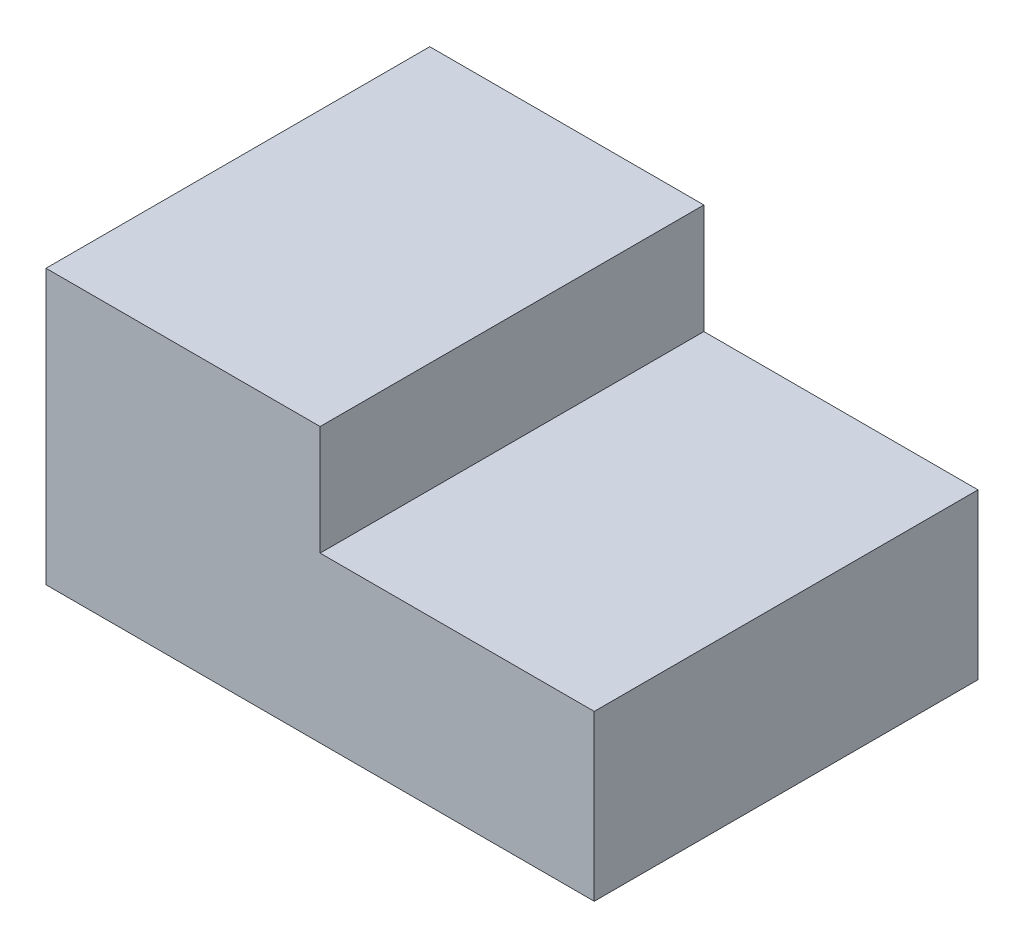
ISO-10303-21;
HEADER;
FILE_DESCRIPTION(('STEP AP214'),'2;1');
FILE_NAME('part.step','',(''),(''),'','','');
FILE_SCHEMA(('AUTOMOTIVE_DESIGN { 1 0 10303 214 1 1 1 1 }'));
ENDSEC;
DATA;
#1=APPLICATION_CONTEXT('core data for automotive mechanical design processes');
#2=APPLICATION_PROTOCOL_DEFINITION('international standard','automotive_design',2000,#1);
#3=PRODUCT_CONTEXT('',#1,'mechanical');
#4=PRODUCT('Part','Part','',(#3));
#5=PRODUCT_RELATED_PRODUCT_CATEGORY('part','',(#4));
#6=PRODUCT_DEFINITION_FORMATION('','',#4);
#7=PRODUCT_DEFINITION_CONTEXT('part definition',#1,'design');
#8=PRODUCT_DEFINITION('design','',#6,#7);
#9=PRODUCT_DEFINITION_SHAPE('','',#8);
#10=(LENGTH_UNIT() NAMED_UNIT(*) SI_UNIT(.MILLI.,.METRE.));
#11=(NAMED_UNIT(*) PLANE_ANGLE_UNIT() SI_UNIT($,.RADIAN.));
#12=(NAMED_UNIT(*) SI_UNIT($,.STERADIAN.) SOLID_ANGLE_UNIT());
#13=UNCERTAINTY_MEASURE_WITH_UNIT(LENGTH_MEASURE(1.E-05),#10,'distance_accuracy_value','');
#14=(GEOMETRIC_REPRESENTATION_CONTEXT(3) GLOBAL_UNCERTAINTY_ASSIGNED_CONTEXT((#13)) GLOBAL_UNIT_ASSIGNED_CONTEXT((#10,
#11,#12)) REPRESENTATION_CONTEXT('',''));
#15=CARTESIAN_POINT('',(0.,0.,0.));
#16=DIRECTION('',(0.,0.,1.));
#17=DIRECTION('',(1.,0.,0.));
#18=AXIS2_PLACEMENT_3D('',#15,#16,#17);
#19=CARTESIAN_POINT('',(0.,5.,3.5));
#20=DIRECTION('',(1.,0.,0.));
#21=DIRECTION('',(0.,0.,-1.));
#22=AXIS2_PLACEMENT_3D('',#19,#20,#21);
#23=PLANE('',#22);
#24=DIRECTION('',(0.,-1.,0.));
#25=VECTOR('',#24,1.);
#26=CARTESIAN_POINT('',(0.,4.1,-1.6));
#27=LINE('',#26,#25);
#28=CARTESIAN_POINT('',(0.,4.1,-1.6));
#29=VERTEX_POINT('',#28);
#30=CARTESIAN_POINT('',(0.,0.9,-1.6));
#31=VERTEX_POINT('',#30);
#32=EDGE_CURVE('E176',#29,#31,#27,.T.);
#33=ORIENTED_EDGE('',*,*,#32,.F.);
#34=DIRECTION('',(0.,0.,-1.));
#35=VECTOR('',#34,1.);
#36=CARTESIAN_POINT('',(0.,4.1,1.6));
#37=LINE('',#36,#35);
#38=CARTESIAN_POINT('',(0.,4.1,1.6));
#39=VERTEX_POINT('',#38);
#40=EDGE_CURVE('E48',#39,#29,#37,.T.);
#41=ORIENTED_EDGE('',*,*,#40,.F.);
#42=DIRECTION('',(0.,1.,0.));
#43=VECTOR('',#42,1.);
#44=CARTESIAN_POINT('',(0.,4.1,1.6));
#45=LINE('',#44,#43);
#46=CARTESIAN_POINT('',(0.,0.9,1.6));
#47=VERTEX_POINT('',#46);
#48=EDGE_CURVE('E169',#47,#39,#45,.T.);
#49=ORIENTED_EDGE('',*,*,#48,.F.);
#50=DIRECTION('',(0.,0.,1.));
#51=VECTOR('',#50,1.);
#52=CARTESIAN_POINT('',(0.,0.9,1.6));
#53=LINE('',#52,#51);
#54=EDGE_CURVE('E173',#31,#47,#53,.T.);
#55=ORIENTED_EDGE('',*,*,#54,.F.);
#56=EDGE_LOOP('',(#33,#41,#49,#55));
#57=FACE_BOUND('',#56,.T.);
#58=DIRECTION('',(0.,-1.,0.));
#59=VECTOR('',#58,1.);
#60=CARTESIAN_POINT('',(0.,5.,-3.5));
#61=LINE('',#60,#59);
#62=CARTESIAN_POINT('',(0.,5.,-3.5));
#63=VERTEX_POINT('',#62);
#64=CARTESIAN_POINT('',(0.,0.,-3.5));
#65=VERTEX_POINT('',#64);
#66=EDGE_CURVE('E130',#63,#65,#61,.T.);
#67=ORIENTED_EDGE('',*,*,#66,.T.);
#68=DIRECTION('',(0.,0.,-1.));
#69=VECTOR('',#68,1.);
#70=CARTESIAN_POINT('',(0.,0.,3.5));
#71=LINE('',#70,#69);
#72=CARTESIAN_POINT('',(0.,0.,3.5));
#73=VERTEX_POINT('',#72);
#74=EDGE_CURVE('E11',#73,#65,#71,.T.);
#75=ORIENTED_EDGE('',*,*,#74,.F.);
#76=DIRECTION('',(0.,-1.,0.));
#77=VECTOR('',#76,1.);
#78=CARTESIAN_POINT('',(0.,5.,3.5));
#79=LINE('',#78,#77);
#80=CARTESIAN_POINT('',(0.,5.,3.5));
#81=VERTEX_POINT('',#80);
#82=EDGE_CURVE('E142',#81,#73,#79,.T.);
#83=ORIENTED_EDGE('',*,*,#82,.F.);
#84=DIRECTION('',(0.,0.,-1.));
#85=VECTOR('',#84,1.);
#86=CARTESIAN_POINT('',(0.,5.,3.5));
#87=LINE('',#86,#85);
#88=EDGE_CURVE('E126',#81,#63,#87,.T.);
#89=ORIENTED_EDGE('',*,*,#88,.T.);
#90=EDGE_LOOP('',(#67,#75,#83,#89));
#91=FACE_BOUND('',#90,.T.);
#92=ADVANCED_FACE('F34',(#57,#91),#23,.F.);
#93=CARTESIAN_POINT('',(0.,0.,3.5));
#94=DIRECTION('',(0.,1.,0.));
#95=DIRECTION('',(0.,0.,1.));
#96=AXIS2_PLACEMENT_3D('',#93,#94,#95);
#97=PLANE('',#96);
#98=DIRECTION('',(1.,0.,0.));
#99=VECTOR('',#98,1.);
#100=CARTESIAN_POINT('',(0.,0.,-3.5));
#101=LINE('',#100,#99);
#102=CARTESIAN_POINT('',(10.,0.,-3.5));
#103=VERTEX_POINT('',#102);
#104=EDGE_CURVE('E133',#65,#103,#101,.T.);
#105=ORIENTED_EDGE('',*,*,#104,.T.);
#106=DIRECTION('',(0.,0.,-1.));
#107=VECTOR('',#106,1.);
#108=CARTESIAN_POINT('',(10.,0.,3.5));
#109=LINE('',#108,#107);
#110=CARTESIAN_POINT('',(10.,0.,3.5));
#111=VERTEX_POINT('',#110);
#112=EDGE_CURVE('E41',#111,#103,#109,.T.);
#113=ORIENTED_EDGE('',*,*,#112,.F.);
#114=DIRECTION('',(1.,0.,0.));
#115=VECTOR('',#114,1.);
#116=CARTESIAN_POINT('',(0.,0.,3.5));
#117=LINE('',#116,#115);
#118=EDGE_CURVE('E92',#73,#111,#117,.T.);
#119=ORIENTED_EDGE('',*,*,#118,.F.);
#120=ORIENTED_EDGE('',*,*,#74,.T.);
#121=EDGE_LOOP('',(#105,#113,#119,#120));
#122=FACE_BOUND('',#121,.T.);
#123=ADVANCED_FACE('F229',(#122),#97,.F.);
#124=CARTESIAN_POINT('',(10.,0.,3.5));
#125=DIRECTION('',(-1.,0.,0.));
#126=DIRECTION('',(0.,0.,1.));
#127=AXIS2_PLACEMENT_3D('',#124,#125,#126);
#128=PLANE('',#127);
#129=DIRECTION('',(0.,1.,0.));
#130=VECTOR('',#129,1.);
#131=CARTESIAN_POINT('',(10.,0.,-3.5));
#132=LINE('',#131,#130);
#133=CARTESIAN_POINT('',(10.,3.,-3.5));
#134=VERTEX_POINT('',#133);
#135=EDGE_CURVE('E136',#103,#134,#132,.T.);
#136=ORIENTED_EDGE('',*,*,#135,.T.);
#137=DIRECTION('',(0.,0.,-1.));
#138=VECTOR('',#137,1.);
#139=CARTESIAN_POINT('',(10.,3.,3.5));
#140=LINE('',#139,#138);
#141=CARTESIAN_POINT('',(10.,3.,3.5));
#142=VERTEX_POINT('',#141);
#143=EDGE_CURVE('E121',#142,#134,#140,.T.);
#144=ORIENTED_EDGE('',*,*,#143,.F.);
#145=DIRECTION('',(0.,1.,0.));
#146=VECTOR('',#145,1.);
#147=CARTESIAN_POINT('',(10.,0.,3.5));
#148=LINE('',#147,#146);
#149=EDGE_CURVE('E109',#111,#142,#148,.T.);
#150=ORIENTED_EDGE('',*,*,#149,.F.);
#151=ORIENTED_EDGE('',*,*,#112,.T.);
#152=EDGE_LOOP('',(#136,#144,#150,#151));
#153=FACE_BOUND('',#152,.T.);
#154=ADVANCED_FACE('F148',(#153),#128,.F.);
#155=CARTESIAN_POINT('',(10.,3.,3.5));
#156=DIRECTION('',(0.,-1.,0.));
#157=DIRECTION('',(1.,0.,0.));
#158=AXIS2_PLACEMENT_3D('',#155,#156,#157);
#159=PLANE('',#158);
#160=DIRECTION('',(-1.,0.,0.));
#161=VECTOR('',#160,1.);
#162=CARTESIAN_POINT('',(10.,3.,-3.5));
#163=LINE('',#162,#161);
#164=CARTESIAN_POINT('',(5.,3.,-3.5));
#165=VERTEX_POINT('',#164);
#166=EDGE_CURVE('E118',#134,#165,#163,.T.);
#167=ORIENTED_EDGE('',*,*,#166,.T.);
#168=DIRECTION('',(0.,0.,-1.));
#169=VECTOR('',#168,1.);
#170=CARTESIAN_POINT('',(5.,3.,3.5));
#171=LINE('',#170,#169);
#172=CARTESIAN_POINT('',(5.,3.,3.5));
#173=VERTEX_POINT('',#172);
#174=EDGE_CURVE('E115',#173,#165,#171,.T.);
#175=ORIENTED_EDGE('',*,*,#174,.F.);
#176=DIRECTION('',(-1.,0.,0.));
#177=VECTOR('',#176,1.);
#178=CARTESIAN_POINT('',(10.,3.,3.5));
#179=LINE('',#178,#177);
#180=EDGE_CURVE('E102',#142,#173,#179,.T.);
#181=ORIENTED_EDGE('',*,*,#180,.F.);
#182=ORIENTED_EDGE('',*,*,#143,.T.);
#183=EDGE_LOOP('',(#167,#175,#181,#182));
#184=FACE_BOUND('',#183,.T.);
#185=ADVANCED_FACE('F116',(#184),#159,.F.);
#186=CARTESIAN_POINT('',(5.,3.,3.5));
#187=DIRECTION('',(-1.,0.,0.));
#188=DIRECTION('',(0.,0.,1.));
#189=AXIS2_PLACEMENT_3D('',#186,#187,#188);
#190=PLANE('',#189);
#191=DIRECTION('',(0.,1.,0.));
#192=VECTOR('',#191,1.);
#193=CARTESIAN_POINT('',(5.,3.,-3.5));
#194=LINE('',#193,#192);
#195=CARTESIAN_POINT('',(5.,5.,-3.5));
#196=VERTEX_POINT('',#195);
#197=EDGE_CURVE('E139',#165,#196,#194,.T.);
#198=ORIENTED_EDGE('',*,*,#197,.T.);
#199=DIRECTION('',(0.,0.,-1.));
#200=VECTOR('',#199,1.);
#201=CARTESIAN_POINT('',(5.,5.,3.5));
#202=LINE('',#201,#200);
#203=CARTESIAN_POINT('',(5.,5.,3.5));
#204=VERTEX_POINT('',#203);
#205=EDGE_CURVE('E122',#204,#196,#202,.T.);
#206=ORIENTED_EDGE('',*,*,#205,.F.);
#207=DIRECTION('',(0.,1.,0.));
#208=VECTOR('',#207,1.);
#209=CARTESIAN_POINT('',(5.,3.,3.5));
#210=LINE('',#209,#208);
#211=EDGE_CURVE('E106',#173,#204,#210,.T.);
#212=ORIENTED_EDGE('',*,*,#211,.F.);
#213=ORIENTED_EDGE('',*,*,#174,.T.);
#214=EDGE_LOOP('',(#198,#206,#212,#213));
#215=FACE_BOUND('',#214,.T.);
#216=ADVANCED_FACE('F124',(#215),#190,.F.);
#217=CARTESIAN_POINT('',(5.,5.,3.5));
#218=DIRECTION('',(0.,-1.,0.));
#219=DIRECTION('',(1.,0.,0.));
#220=AXIS2_PLACEMENT_3D('',#217,#218,#219);
#221=PLANE('',#220);
#222=DIRECTION('',(-1.,0.,0.));
#223=VECTOR('',#222,1.);
#224=CARTESIAN_POINT('',(5.,5.,-3.5));
#225=LINE('',#224,#223);
#226=EDGE_CURVE('E84',#196,#63,#225,.T.);
#227=ORIENTED_EDGE('',*,*,#226,.T.);
#228=ORIENTED_EDGE('',*,*,#88,.F.);
#229=DIRECTION('',(-1.,0.,0.));
#230=VECTOR('',#229,1.);
#231=CARTESIAN_POINT('',(5.,5.,3.5));
#232=LINE('',#231,#230);
#233=EDGE_CURVE('E57',#204,#81,#232,.T.);
#234=ORIENTED_EDGE('',*,*,#233,.F.);
#235=ORIENTED_EDGE('',*,*,#205,.T.);
#236=EDGE_LOOP('',(#227,#228,#234,#235));
#237=FACE_BOUND('',#236,.T.);
#238=ADVANCED_FACE('F152',(#237),#221,.F.);
#239=CARTESIAN_POINT('',(0.,0.,3.5));
#240=DIRECTION('',(0.,0.,1.));
#241=DIRECTION('',(1.,0.,0.));
#242=AXIS2_PLACEMENT_3D('',#239,#240,#241);
#243=PLANE('',#242);
#244=ORIENTED_EDGE('',*,*,#82,.T.);
#245=ORIENTED_EDGE('',*,*,#118,.T.);
#246=ORIENTED_EDGE('',*,*,#149,.T.);
#247=ORIENTED_EDGE('',*,*,#180,.T.);
#248=ORIENTED_EDGE('',*,*,#211,.T.);
#249=ORIENTED_EDGE('',*,*,#233,.T.);
#250=EDGE_LOOP('',(#244,#245,#246,#247,#248,#249));
#251=FACE_BOUND('',#250,.T.);
#252=ADVANCED_FACE('F104',(#251),#243,.T.);
#253=CARTESIAN_POINT('',(0.,0.,-3.5));
#254=DIRECTION('',(0.,0.,1.));
#255=DIRECTION('',(1.,0.,0.));
#256=AXIS2_PLACEMENT_3D('',#253,#254,#255);
#257=PLANE('',#256);
#258=ORIENTED_EDGE('',*,*,#66,.F.);
#259=ORIENTED_EDGE('',*,*,#226,.F.);
#260=ORIENTED_EDGE('',*,*,#197,.F.);
#261=ORIENTED_EDGE('',*,*,#166,.F.);
#262=ORIENTED_EDGE('',*,*,#135,.F.);
#263=ORIENTED_EDGE('',*,*,#104,.F.);
#264=EDGE_LOOP('',(#258,#259,#260,#261,#262,#263));
#265=FACE_BOUND('',#264,.T.);
#266=ADVANCED_FACE('F151',(#265),#257,.F.);
#267=CARTESIAN_POINT('',(3.,4.1,1.6));
#268=DIRECTION('',(0.,1.,0.));
#269=DIRECTION('',(0.,0.,1.));
#270=AXIS2_PLACEMENT_3D('',#267,#268,#269);
#271=PLANE('',#270);
#272=ORIENTED_EDGE('',*,*,#40,.T.);
#273=DIRECTION('',(-1.,0.,0.));
#274=VECTOR('',#273,1.);
#275=CARTESIAN_POINT('',(3.,4.1,-1.6));
#276=LINE('',#275,#274);
#277=CARTESIAN_POINT('',(3.,4.1,-1.6));
#278=VERTEX_POINT('',#277);
#279=EDGE_CURVE('E159',#278,#29,#276,.T.);
#280=ORIENTED_EDGE('',*,*,#279,.F.);
#281=DIRECTION('',(0.,0.,-1.));
#282=VECTOR('',#281,1.);
#283=CARTESIAN_POINT('',(3.,4.1,1.6));
#284=LINE('',#283,#282);
#285=CARTESIAN_POINT('',(3.,4.1,1.6));
#286=VERTEX_POINT('',#285);
#287=EDGE_CURVE('E172',#286,#278,#284,.T.);
#288=ORIENTED_EDGE('',*,*,#287,.F.);
#289=DIRECTION('',(-1.,0.,0.));
#290=VECTOR('',#289,1.);
#291=CARTESIAN_POINT('',(3.,4.1,1.6));
#292=LINE('',#291,#290);
#293=EDGE_CURVE('E134',#286,#39,#292,.T.);
#294=ORIENTED_EDGE('',*,*,#293,.T.);
#295=EDGE_LOOP('',(#272,#280,#288,#294));
#296=FACE_BOUND('',#295,.T.);
#297=ADVANCED_FACE('F197',(#296),#271,.F.);
#298=CARTESIAN_POINT('',(3.,4.1,1.6));
#299=DIRECTION('',(0.,0.,1.));
#300=DIRECTION('',(1.,0.,0.));
#301=AXIS2_PLACEMENT_3D('',#298,#299,#300);
#302=PLANE('',#301);
#303=ORIENTED_EDGE('',*,*,#48,.T.);
#304=ORIENTED_EDGE('',*,*,#293,.F.);
#305=DIRECTION('',(0.,1.,0.));
#306=VECTOR('',#305,1.);
#307=CARTESIAN_POINT('',(3.,4.1,1.6));
#308=LINE('',#307,#306);
#309=CARTESIAN_POINT('',(3.,0.9,1.6));
#310=VERTEX_POINT('',#309);
#311=EDGE_CURVE('E162',#310,#286,#308,.T.);
#312=ORIENTED_EDGE('',*,*,#311,.F.);
#313=DIRECTION('',(-1.,0.,0.));
#314=VECTOR('',#313,1.);
#315=CARTESIAN_POINT('',(3.,0.9,1.6));
#316=LINE('',#315,#314);
#317=EDGE_CURVE('E165',#310,#47,#316,.T.);
#318=ORIENTED_EDGE('',*,*,#317,.T.);
#319=EDGE_LOOP('',(#303,#304,#312,#318));
#320=FACE_BOUND('',#319,.T.);
#321=ADVANCED_FACE('F208',(#320),#302,.F.);
#322=CARTESIAN_POINT('',(3.,0.9,1.6));
#323=DIRECTION('',(0.,-1.,0.));
#324=DIRECTION('',(0.,0.,-1.));
#325=AXIS2_PLACEMENT_3D('',#322,#323,#324);
#326=PLANE('',#325);
#327=ORIENTED_EDGE('',*,*,#54,.T.);
#328=ORIENTED_EDGE('',*,*,#317,.F.);
#329=DIRECTION('',(0.,0.,1.));
#330=VECTOR('',#329,1.);
#331=CARTESIAN_POINT('',(3.,0.9,1.6));
#332=LINE('',#331,#330);
#333=CARTESIAN_POINT('',(3.,0.9,-1.6));
#334=VERTEX_POINT('',#333);
#335=EDGE_CURVE('E182',#334,#310,#332,.T.);
#336=ORIENTED_EDGE('',*,*,#335,.F.);
#337=DIRECTION('',(-1.,0.,0.));
#338=VECTOR('',#337,1.);
#339=CARTESIAN_POINT('',(3.,0.9,-1.6));
#340=LINE('',#339,#338);
#341=EDGE_CURVE('E161',#334,#31,#340,.T.);
#342=ORIENTED_EDGE('',*,*,#341,.T.);
#343=EDGE_LOOP('',(#327,#328,#336,#342));
#344=FACE_BOUND('',#343,.T.);
#345=ADVANCED_FACE('F213',(#344),#326,.F.);
#346=CARTESIAN_POINT('',(3.,4.1,-1.6));
#347=DIRECTION('',(0.,0.,-1.));
#348=DIRECTION('',(-1.,0.,0.));
#349=AXIS2_PLACEMENT_3D('',#346,#347,#348);
#350=PLANE('',#349);
#351=ORIENTED_EDGE('',*,*,#32,.T.);
#352=ORIENTED_EDGE('',*,*,#341,.F.);
#353=DIRECTION('',(0.,-1.,0.));
#354=VECTOR('',#353,1.);
#355=CARTESIAN_POINT('',(3.,4.1,-1.6));
#356=LINE('',#355,#354);
#357=EDGE_CURVE('E185',#278,#334,#356,.T.);
#358=ORIENTED_EDGE('',*,*,#357,.F.);
#359=ORIENTED_EDGE('',*,*,#279,.T.);
#360=EDGE_LOOP('',(#351,#352,#358,#359));
#361=FACE_BOUND('',#360,.T.);
#362=ADVANCED_FACE('F218',(#361),#350,.F.);
#363=CARTESIAN_POINT('',(3.,0.,0.));
#364=DIRECTION('',(-1.,0.,0.));
#365=DIRECTION('',(0.,0.,1.));
#366=AXIS2_PLACEMENT_3D('',#363,#364,#365);
#367=PLANE('',#366);
#368=ORIENTED_EDGE('',*,*,#287,.T.);
#369=ORIENTED_EDGE('',*,*,#357,.T.);
#370=ORIENTED_EDGE('',*,*,#335,.T.);
#371=ORIENTED_EDGE('',*,*,#311,.T.);
#372=EDGE_LOOP('',(#368,#369,#370,#371));
#373=FACE_BOUND('',#372,.T.);
#374=ADVANCED_FACE('F192',(#373),#367,.T.);
#375=CLOSED_SHELL('',(#92,#123,#154,#185,#216,#238,#252,#266,#297,#321,#345,#362,#374));
#376=MANIFOLD_SOLID_BREP('B2',#375);
#377=ADVANCED_BREP_SHAPE_REPRESENTATION('',(#18,#376),#14);
#378=SHAPE_DEFINITION_REPRESENTATION(#9,#377);
ENDSEC;
END-ISO-10303-21;
